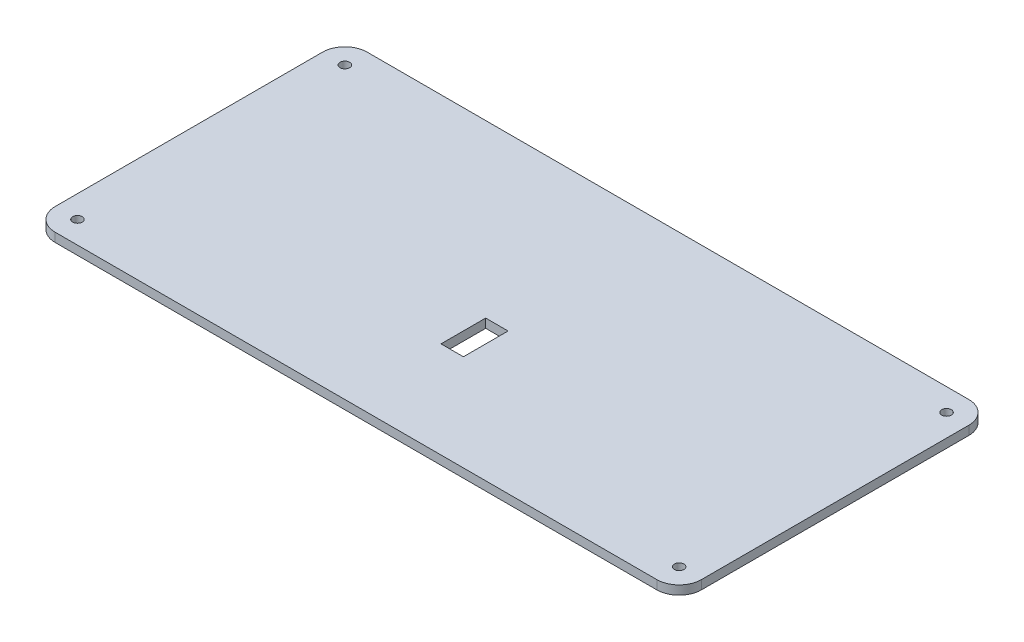
ISO-10303-21;
HEADER;
FILE_DESCRIPTION(('STEP AP214'),'2;1');
FILE_NAME('part.step','',(''),(''),'','','');
FILE_SCHEMA(('AUTOMOTIVE_DESIGN { 1 0 10303 214 1 1 1 1 }'));
ENDSEC;
DATA;
#1=APPLICATION_CONTEXT('core data for automotive mechanical design processes');
#2=APPLICATION_PROTOCOL_DEFINITION('international standard','automotive_design',2000,#1);
#3=PRODUCT_CONTEXT('',#1,'mechanical');
#4=PRODUCT('Part','Part','',(#3));
#5=PRODUCT_RELATED_PRODUCT_CATEGORY('part','',(#4));
#6=PRODUCT_DEFINITION_FORMATION('','',#4);
#7=PRODUCT_DEFINITION_CONTEXT('part definition',#1,'design');
#8=PRODUCT_DEFINITION('design','',#6,#7);
#9=PRODUCT_DEFINITION_SHAPE('','',#8);
#10=(LENGTH_UNIT() NAMED_UNIT(*) SI_UNIT(.MILLI.,.METRE.));
#11=(NAMED_UNIT(*) PLANE_ANGLE_UNIT() SI_UNIT($,.RADIAN.));
#12=(NAMED_UNIT(*) SI_UNIT($,.STERADIAN.) SOLID_ANGLE_UNIT());
#13=UNCERTAINTY_MEASURE_WITH_UNIT(LENGTH_MEASURE(1.E-05),#10,'distance_accuracy_value','');
#14=(GEOMETRIC_REPRESENTATION_CONTEXT(3) GLOBAL_UNCERTAINTY_ASSIGNED_CONTEXT((#13)) GLOBAL_UNIT_ASSIGNED_CONTEXT((#10,
#11,#12)) REPRESENTATION_CONTEXT('',''));
#15=CARTESIAN_POINT('',(0.,0.,0.));
#16=DIRECTION('',(0.,0.,1.));
#17=DIRECTION('',(1.,0.,0.));
#18=AXIS2_PLACEMENT_3D('',#15,#16,#17);
#19=CARTESIAN_POINT('',(0.,4.,70.));
#20=DIRECTION('',(0.,0.,1.));
#21=DIRECTION('',(1.,0.,0.));
#22=AXIS2_PLACEMENT_3D('',#19,#20,#21);
#23=PLANE('',#22);
#24=DIRECTION('',(-1.,0.,0.));
#25=VECTOR('',#24,1.);
#26=CARTESIAN_POINT('',(0.,0.,70.));
#27=LINE('',#26,#25);
#28=CARTESIAN_POINT('',(135.,0.,70.));
#29=VERTEX_POINT('',#28);
#30=CARTESIAN_POINT('',(-135.,0.,70.));
#31=VERTEX_POINT('',#30);
#32=EDGE_CURVE('E236',#29,#31,#27,.T.);
#33=ORIENTED_EDGE('',*,*,#32,.F.);
#34=DIRECTION('',(0.,-1.,0.));
#35=VECTOR('',#34,1.);
#36=CARTESIAN_POINT('',(135.,4.,70.));
#37=LINE('',#36,#35);
#38=CARTESIAN_POINT('',(135.,4.,70.));
#39=VERTEX_POINT('',#38);
#40=EDGE_CURVE('E11',#39,#29,#37,.T.);
#41=ORIENTED_EDGE('',*,*,#40,.F.);
#42=DIRECTION('',(-1.,0.,0.));
#43=VECTOR('',#42,1.);
#44=CARTESIAN_POINT('',(0.,4.,70.));
#45=LINE('',#44,#43);
#46=CARTESIAN_POINT('',(-135.,4.,70.));
#47=VERTEX_POINT('',#46);
#48=EDGE_CURVE('E226',#39,#47,#45,.T.);
#49=ORIENTED_EDGE('',*,*,#48,.T.);
#50=DIRECTION('',(0.,-1.,0.));
#51=VECTOR('',#50,1.);
#52=CARTESIAN_POINT('',(-135.,4.,70.));
#53=LINE('',#52,#51);
#54=EDGE_CURVE('E210',#47,#31,#53,.T.);
#55=ORIENTED_EDGE('',*,*,#54,.T.);
#56=EDGE_LOOP('',(#33,#41,#49,#55));
#57=FACE_BOUND('',#56,.T.);
#58=ADVANCED_FACE('F37',(#57),#23,.T.);
#59=CARTESIAN_POINT('',(135.,4.,60.));
#60=DIRECTION('',(0.,-1.,0.));
#61=DIRECTION('',(0.,0.,-1.));
#62=AXIS2_PLACEMENT_3D('',#59,#60,#61);
#63=CYLINDRICAL_SURFACE('',#62,10.);
#64=CARTESIAN_POINT('',(135.,0.,60.));
#65=DIRECTION('',(0.,1.,0.));
#66=DIRECTION('',(0.,0.,1.));
#67=AXIS2_PLACEMENT_3D('',#64,#65,#66);
#68=CIRCLE('',#67,10.);
#69=CARTESIAN_POINT('',(145.,0.,59.9999999999999));
#70=VERTEX_POINT('',#69);
#71=EDGE_CURVE('E238',#29,#70,#68,.T.);
#72=ORIENTED_EDGE('',*,*,#71,.T.);
#73=DIRECTION('',(0.,-1.,0.));
#74=VECTOR('',#73,1.);
#75=CARTESIAN_POINT('',(145.,4.,59.9999999999999));
#76=LINE('',#75,#74);
#77=CARTESIAN_POINT('',(145.,4.,59.9999999999999));
#78=VERTEX_POINT('',#77);
#79=EDGE_CURVE('E45',#78,#70,#76,.T.);
#80=ORIENTED_EDGE('',*,*,#79,.F.);
#81=CARTESIAN_POINT('',(135.,4.,60.));
#82=DIRECTION('',(0.,1.,0.));
#83=DIRECTION('',(0.,0.,1.));
#84=AXIS2_PLACEMENT_3D('',#81,#82,#83);
#85=CIRCLE('',#84,10.);
#86=EDGE_CURVE('E229',#39,#78,#85,.T.);
#87=ORIENTED_EDGE('',*,*,#86,.F.);
#88=ORIENTED_EDGE('',*,*,#40,.T.);
#89=EDGE_LOOP('',(#72,#80,#87,#88));
#90=FACE_BOUND('',#89,.T.);
#91=ADVANCED_FACE('F249',(#90),#63,.T.);
#92=CARTESIAN_POINT('',(145.,4.,0.));
#93=DIRECTION('',(1.,0.,0.));
#94=DIRECTION('',(0.,0.,-1.));
#95=AXIS2_PLACEMENT_3D('',#92,#93,#94);
#96=PLANE('',#95);
#97=DIRECTION('',(0.,0.,1.));
#98=VECTOR('',#97,1.);
#99=CARTESIAN_POINT('',(145.,0.,0.));
#100=LINE('',#99,#98);
#101=CARTESIAN_POINT('',(145.,0.,-59.9999999999999));
#102=VERTEX_POINT('',#101);
#103=EDGE_CURVE('E227',#102,#70,#100,.T.);
#104=ORIENTED_EDGE('',*,*,#103,.F.);
#105=DIRECTION('',(0.,-1.,0.));
#106=VECTOR('',#105,1.);
#107=CARTESIAN_POINT('',(145.,4.,-59.9999999999999));
#108=LINE('',#107,#106);
#109=CARTESIAN_POINT('',(145.,4.,-59.9999999999999));
#110=VERTEX_POINT('',#109);
#111=EDGE_CURVE('E176',#110,#102,#108,.T.);
#112=ORIENTED_EDGE('',*,*,#111,.F.);
#113=DIRECTION('',(0.,0.,1.));
#114=VECTOR('',#113,1.);
#115=CARTESIAN_POINT('',(145.,4.,0.));
#116=LINE('',#115,#114);
#117=EDGE_CURVE('E231',#110,#78,#116,.T.);
#118=ORIENTED_EDGE('',*,*,#117,.T.);
#119=ORIENTED_EDGE('',*,*,#79,.T.);
#120=EDGE_LOOP('',(#104,#112,#118,#119));
#121=FACE_BOUND('',#120,.T.);
#122=ADVANCED_FACE('F244',(#121),#96,.T.);
#123=CARTESIAN_POINT('',(135.,4.,60.));
#124=DIRECTION('',(0.,-1.,0.));
#125=DIRECTION('',(0.,0.,-1.));
#126=AXIS2_PLACEMENT_3D('',#123,#124,#125);
#127=CYLINDRICAL_SURFACE('',#126,2.15000000000002);
#128=CARTESIAN_POINT('',(135.,4.,60.));
#129=DIRECTION('',(0.,1.,0.));
#130=DIRECTION('',(0.,0.,1.));
#131=AXIS2_PLACEMENT_3D('',#128,#129,#130);
#132=CIRCLE('',#131,2.15000000000002);
#133=CARTESIAN_POINT('',(135.,4.,62.15));
#134=VERTEX_POINT('',#133);
#135=EDGE_CURVE('E223',#134,#134,#132,.T.);
#136=ORIENTED_EDGE('',*,*,#135,.T.);
#137=EDGE_LOOP('',(#136));
#138=FACE_BOUND('',#137,.T.);
#139=CARTESIAN_POINT('',(135.,0.,60.));
#140=DIRECTION('',(0.,1.,0.));
#141=DIRECTION('',(0.,0.,1.));
#142=AXIS2_PLACEMENT_3D('',#139,#140,#141);
#143=CIRCLE('',#142,2.15000000000002);
#144=CARTESIAN_POINT('',(135.,0.,62.15));
#145=VERTEX_POINT('',#144);
#146=EDGE_CURVE('E222',#145,#145,#143,.T.);
#147=ORIENTED_EDGE('',*,*,#146,.F.);
#148=EDGE_LOOP('',(#147));
#149=FACE_BOUND('',#148,.T.);
#150=ADVANCED_FACE('F39',(#138,#149),#127,.F.);
#151=CARTESIAN_POINT('',(0.,4.,0.));
#152=DIRECTION('',(0.,1.,0.));
#153=DIRECTION('',(0.,0.,1.));
#154=AXIS2_PLACEMENT_3D('',#151,#152,#153);
#155=PLANE('',#154);
#156=DIRECTION('',(0.,0.,1.));
#157=VECTOR('',#156,1.);
#158=CARTESIAN_POINT('',(-5.04999999999998,4.,26.8091388827732));
#159=LINE('',#158,#157);
#160=CARTESIAN_POINT('',(-5.04999999999998,4.,6.75913888277318));
#161=VERTEX_POINT('',#160);
#162=CARTESIAN_POINT('',(-5.04999999999998,4.,26.8091388827732));
#163=VERTEX_POINT('',#162);
#164=EDGE_CURVE('E52',#161,#163,#159,.T.);
#165=ORIENTED_EDGE('',*,*,#164,.F.);
#166=DIRECTION('',(-1.,0.,0.));
#167=VECTOR('',#166,1.);
#168=CARTESIAN_POINT('',(-5.04999999999998,4.,6.75913888277318));
#169=LINE('',#168,#167);
#170=CARTESIAN_POINT('',(5.00000000000002,4.,6.75913888277318));
#171=VERTEX_POINT('',#170);
#172=EDGE_CURVE('E143',#171,#161,#169,.T.);
#173=ORIENTED_EDGE('',*,*,#172,.F.);
#174=DIRECTION('',(0.,0.,-1.));
#175=VECTOR('',#174,1.);
#176=CARTESIAN_POINT('',(5.00000000000002,4.,26.8091388827732));
#177=LINE('',#176,#175);
#178=CARTESIAN_POINT('',(5.00000000000002,4.,26.8091388827732));
#179=VERTEX_POINT('',#178);
#180=EDGE_CURVE('E146',#179,#171,#177,.T.);
#181=ORIENTED_EDGE('',*,*,#180,.F.);
#182=DIRECTION('',(1.,0.,0.));
#183=VECTOR('',#182,1.);
#184=CARTESIAN_POINT('',(-5.04999999999998,4.,26.8091388827732));
#185=LINE('',#184,#183);
#186=EDGE_CURVE('E152',#163,#179,#185,.T.);
#187=ORIENTED_EDGE('',*,*,#186,.F.);
#188=EDGE_LOOP('',(#165,#173,#181,#187));
#189=FACE_BOUND('',#188,.T.);
#190=ORIENTED_EDGE('',*,*,#117,.F.);
#191=CARTESIAN_POINT('',(135.,4.,-60.));
#192=DIRECTION('',(0.,-1.,0.));
#193=DIRECTION('',(0.,0.,-1.));
#194=AXIS2_PLACEMENT_3D('',#191,#192,#193);
#195=CIRCLE('',#194,10.);
#196=CARTESIAN_POINT('',(135.,4.,-70.));
#197=VERTEX_POINT('',#196);
#198=EDGE_CURVE('E165',#197,#110,#195,.T.);
#199=ORIENTED_EDGE('',*,*,#198,.F.);
#200=DIRECTION('',(1.,0.,0.));
#201=VECTOR('',#200,1.);
#202=CARTESIAN_POINT('',(0.,4.,-70.));
#203=LINE('',#202,#201);
#204=CARTESIAN_POINT('',(-135.,4.,-70.));
#205=VERTEX_POINT('',#204);
#206=EDGE_CURVE('E183',#205,#197,#203,.T.);
#207=ORIENTED_EDGE('',*,*,#206,.F.);
#208=CARTESIAN_POINT('',(-135.,4.,-60.));
#209=DIRECTION('',(0.,1.,0.));
#210=DIRECTION('',(0.,0.,-1.));
#211=AXIS2_PLACEMENT_3D('',#208,#209,#210);
#212=CIRCLE('',#211,10.);
#213=CARTESIAN_POINT('',(-145.,4.,-59.9999999999999));
#214=VERTEX_POINT('',#213);
#215=EDGE_CURVE('E186',#205,#214,#212,.T.);
#216=ORIENTED_EDGE('',*,*,#215,.T.);
#217=DIRECTION('',(0.,0.,1.));
#218=VECTOR('',#217,1.);
#219=CARTESIAN_POINT('',(-145.,4.,0.));
#220=LINE('',#219,#218);
#221=CARTESIAN_POINT('',(-145.,4.,59.9999999999999));
#222=VERTEX_POINT('',#221);
#223=EDGE_CURVE('E204',#214,#222,#220,.T.);
#224=ORIENTED_EDGE('',*,*,#223,.T.);
#225=CARTESIAN_POINT('',(-135.,4.,60.));
#226=DIRECTION('',(0.,-1.,0.));
#227=DIRECTION('',(0.,0.,1.));
#228=AXIS2_PLACEMENT_3D('',#225,#226,#227);
#229=CIRCLE('',#228,10.);
#230=EDGE_CURVE('E207',#47,#222,#229,.T.);
#231=ORIENTED_EDGE('',*,*,#230,.F.);
#232=ORIENTED_EDGE('',*,*,#48,.F.);
#233=ORIENTED_EDGE('',*,*,#86,.T.);
#234=EDGE_LOOP('',(#190,#199,#207,#216,#224,#231,#232,#233));
#235=FACE_BOUND('',#234,.T.);
#236=ORIENTED_EDGE('',*,*,#135,.F.);
#237=EDGE_LOOP('',(#236));
#238=FACE_BOUND('',#237,.T.);
#239=CARTESIAN_POINT('',(-135.,4.,60.));
#240=DIRECTION('',(0.,-1.,0.));
#241=DIRECTION('',(0.,0.,1.));
#242=AXIS2_PLACEMENT_3D('',#239,#240,#241);
#243=CIRCLE('',#242,2.15000000000002);
#244=CARTESIAN_POINT('',(-135.,4.,62.15));
#245=VERTEX_POINT('',#244);
#246=EDGE_CURVE('E201',#245,#245,#243,.T.);
#247=ORIENTED_EDGE('',*,*,#246,.T.);
#248=EDGE_LOOP('',(#247));
#249=FACE_BOUND('',#248,.T.);
#250=CARTESIAN_POINT('',(-135.,4.,-60.));
#251=DIRECTION('',(0.,1.,0.));
#252=DIRECTION('',(0.,0.,-1.));
#253=AXIS2_PLACEMENT_3D('',#250,#251,#252);
#254=CIRCLE('',#253,2.15000000000002);
#255=CARTESIAN_POINT('',(-135.,4.,-62.15));
#256=VERTEX_POINT('',#255);
#257=EDGE_CURVE('E180',#256,#256,#254,.T.);
#258=ORIENTED_EDGE('',*,*,#257,.F.);
#259=EDGE_LOOP('',(#258));
#260=FACE_BOUND('',#259,.T.);
#261=CARTESIAN_POINT('',(135.,4.,-60.));
#262=DIRECTION('',(0.,-1.,0.));
#263=DIRECTION('',(0.,0.,-1.));
#264=AXIS2_PLACEMENT_3D('',#261,#262,#263);
#265=CIRCLE('',#264,2.15000000000002);
#266=CARTESIAN_POINT('',(135.,4.,-62.15));
#267=VERTEX_POINT('',#266);
#268=EDGE_CURVE('E162',#267,#267,#265,.T.);
#269=ORIENTED_EDGE('',*,*,#268,.T.);
#270=EDGE_LOOP('',(#269));
#271=FACE_BOUND('',#270,.T.);
#272=ADVANCED_FACE('F261',(#189,#235,#238,#249,#260,#271),#155,.T.);
#273=CARTESIAN_POINT('',(0.,0.,0.));
#274=DIRECTION('',(0.,1.,0.));
#275=DIRECTION('',(0.,0.,1.));
#276=AXIS2_PLACEMENT_3D('',#273,#274,#275);
#277=PLANE('',#276);
#278=DIRECTION('',(-1.,0.,0.));
#279=VECTOR('',#278,1.);
#280=CARTESIAN_POINT('',(-5.04999999999998,0.,6.75913888277318));
#281=LINE('',#280,#279);
#282=CARTESIAN_POINT('',(5.00000000000002,0.,6.75913888277318));
#283=VERTEX_POINT('',#282);
#284=CARTESIAN_POINT('',(-5.04999999999998,0.,6.75913888277318));
#285=VERTEX_POINT('',#284);
#286=EDGE_CURVE('E133',#283,#285,#281,.T.);
#287=ORIENTED_EDGE('',*,*,#286,.T.);
#288=DIRECTION('',(0.,0.,1.));
#289=VECTOR('',#288,1.);
#290=CARTESIAN_POINT('',(-5.04999999999998,0.,26.8091388827732));
#291=LINE('',#290,#289);
#292=CARTESIAN_POINT('',(-5.04999999999998,0.,26.8091388827732));
#293=VERTEX_POINT('',#292);
#294=EDGE_CURVE('E127',#285,#293,#291,.T.);
#295=ORIENTED_EDGE('',*,*,#294,.T.);
#296=DIRECTION('',(1.,0.,0.));
#297=VECTOR('',#296,1.);
#298=CARTESIAN_POINT('',(-5.04999999999998,0.,26.8091388827732));
#299=LINE('',#298,#297);
#300=CARTESIAN_POINT('',(5.00000000000002,0.,26.8091388827732));
#301=VERTEX_POINT('',#300);
#302=EDGE_CURVE('E136',#293,#301,#299,.T.);
#303=ORIENTED_EDGE('',*,*,#302,.T.);
#304=DIRECTION('',(0.,0.,-1.));
#305=VECTOR('',#304,1.);
#306=CARTESIAN_POINT('',(5.00000000000002,0.,26.8091388827732));
#307=LINE('',#306,#305);
#308=EDGE_CURVE('E60',#301,#283,#307,.T.);
#309=ORIENTED_EDGE('',*,*,#308,.T.);
#310=EDGE_LOOP('',(#287,#295,#303,#309));
#311=FACE_BOUND('',#310,.T.);
#312=CARTESIAN_POINT('',(135.,0.,-60.));
#313=DIRECTION('',(0.,-1.,0.));
#314=DIRECTION('',(0.,0.,-1.));
#315=AXIS2_PLACEMENT_3D('',#312,#313,#314);
#316=CIRCLE('',#315,10.);
#317=CARTESIAN_POINT('',(135.,0.,-70.));
#318=VERTEX_POINT('',#317);
#319=EDGE_CURVE('E166',#318,#102,#316,.T.);
#320=ORIENTED_EDGE('',*,*,#319,.T.);
#321=ORIENTED_EDGE('',*,*,#103,.T.);
#322=ORIENTED_EDGE('',*,*,#71,.F.);
#323=ORIENTED_EDGE('',*,*,#32,.T.);
#324=CARTESIAN_POINT('',(-135.,0.,60.));
#325=DIRECTION('',(0.,-1.,0.));
#326=DIRECTION('',(0.,0.,1.));
#327=AXIS2_PLACEMENT_3D('',#324,#325,#326);
#328=CIRCLE('',#327,10.);
#329=CARTESIAN_POINT('',(-145.,0.,59.9999999999999));
#330=VERTEX_POINT('',#329);
#331=EDGE_CURVE('E205',#31,#330,#328,.T.);
#332=ORIENTED_EDGE('',*,*,#331,.T.);
#333=DIRECTION('',(0.,0.,1.));
#334=VECTOR('',#333,1.);
#335=CARTESIAN_POINT('',(-145.,0.,0.));
#336=LINE('',#335,#334);
#337=CARTESIAN_POINT('',(-145.,0.,-59.9999999999999));
#338=VERTEX_POINT('',#337);
#339=EDGE_CURVE('E213',#338,#330,#336,.T.);
#340=ORIENTED_EDGE('',*,*,#339,.F.);
#341=CARTESIAN_POINT('',(-135.,0.,-60.));
#342=DIRECTION('',(0.,1.,0.));
#343=DIRECTION('',(0.,0.,-1.));
#344=AXIS2_PLACEMENT_3D('',#341,#342,#343);
#345=CIRCLE('',#344,10.);
#346=CARTESIAN_POINT('',(-135.,0.,-70.));
#347=VERTEX_POINT('',#346);
#348=EDGE_CURVE('E184',#347,#338,#345,.T.);
#349=ORIENTED_EDGE('',*,*,#348,.F.);
#350=DIRECTION('',(1.,0.,0.));
#351=VECTOR('',#350,1.);
#352=CARTESIAN_POINT('',(0.,0.,-70.));
#353=LINE('',#352,#351);
#354=EDGE_CURVE('E192',#347,#318,#353,.T.);
#355=ORIENTED_EDGE('',*,*,#354,.T.);
#356=EDGE_LOOP('',(#320,#321,#322,#323,#332,#340,#349,#355));
#357=FACE_BOUND('',#356,.T.);
#358=ORIENTED_EDGE('',*,*,#146,.T.);
#359=EDGE_LOOP('',(#358));
#360=FACE_BOUND('',#359,.T.);
#361=CARTESIAN_POINT('',(-135.,0.,60.));
#362=DIRECTION('',(0.,-1.,0.));
#363=DIRECTION('',(0.,0.,1.));
#364=AXIS2_PLACEMENT_3D('',#361,#362,#363);
#365=CIRCLE('',#364,2.15000000000002);
#366=CARTESIAN_POINT('',(-135.,0.,62.15));
#367=VERTEX_POINT('',#366);
#368=EDGE_CURVE('E200',#367,#367,#365,.T.);
#369=ORIENTED_EDGE('',*,*,#368,.F.);
#370=EDGE_LOOP('',(#369));
#371=FACE_BOUND('',#370,.T.);
#372=CARTESIAN_POINT('',(-135.,0.,-60.));
#373=DIRECTION('',(0.,1.,0.));
#374=DIRECTION('',(0.,0.,-1.));
#375=AXIS2_PLACEMENT_3D('',#372,#373,#374);
#376=CIRCLE('',#375,2.15000000000002);
#377=CARTESIAN_POINT('',(-135.,0.,-62.15));
#378=VERTEX_POINT('',#377);
#379=EDGE_CURVE('E179',#378,#378,#376,.T.);
#380=ORIENTED_EDGE('',*,*,#379,.T.);
#381=EDGE_LOOP('',(#380));
#382=FACE_BOUND('',#381,.T.);
#383=CARTESIAN_POINT('',(135.,0.,-60.));
#384=DIRECTION('',(0.,-1.,0.));
#385=DIRECTION('',(0.,0.,-1.));
#386=AXIS2_PLACEMENT_3D('',#383,#384,#385);
#387=CIRCLE('',#386,2.15000000000002);
#388=CARTESIAN_POINT('',(135.,0.,-62.15));
#389=VERTEX_POINT('',#388);
#390=EDGE_CURVE('E158',#389,#389,#387,.T.);
#391=ORIENTED_EDGE('',*,*,#390,.F.);
#392=EDGE_LOOP('',(#391));
#393=FACE_BOUND('',#392,.T.);
#394=ADVANCED_FACE('F140',(#311,#357,#360,#371,#382,#393),#277,.F.);
#395=CARTESIAN_POINT('',(-145.,4.,0.));
#396=DIRECTION('',(1.,0.,0.));
#397=DIRECTION('',(0.,0.,-1.));
#398=AXIS2_PLACEMENT_3D('',#395,#396,#397);
#399=PLANE('',#398);
#400=ORIENTED_EDGE('',*,*,#339,.T.);
#401=DIRECTION('',(0.,-1.,0.));
#402=VECTOR('',#401,1.);
#403=CARTESIAN_POINT('',(-145.,4.,59.9999999999999));
#404=LINE('',#403,#402);
#405=EDGE_CURVE('E220',#222,#330,#404,.T.);
#406=ORIENTED_EDGE('',*,*,#405,.F.);
#407=ORIENTED_EDGE('',*,*,#223,.F.);
#408=DIRECTION('',(0.,-1.,0.));
#409=VECTOR('',#408,1.);
#410=CARTESIAN_POINT('',(-145.,4.,-59.9999999999999));
#411=LINE('',#410,#409);
#412=EDGE_CURVE('E189',#214,#338,#411,.T.);
#413=ORIENTED_EDGE('',*,*,#412,.T.);
#414=EDGE_LOOP('',(#400,#406,#407,#413));
#415=FACE_BOUND('',#414,.T.);
#416=ADVANCED_FACE('F273',(#415),#399,.F.);
#417=CARTESIAN_POINT('',(-135.,4.,60.));
#418=DIRECTION('',(0.,-1.,0.));
#419=DIRECTION('',(0.,0.,-1.));
#420=AXIS2_PLACEMENT_3D('',#417,#418,#419);
#421=CYLINDRICAL_SURFACE('',#420,2.15000000000002);
#422=ORIENTED_EDGE('',*,*,#246,.F.);
#423=EDGE_LOOP('',(#422));
#424=FACE_BOUND('',#423,.T.);
#425=ORIENTED_EDGE('',*,*,#368,.T.);
#426=EDGE_LOOP('',(#425));
#427=FACE_BOUND('',#426,.T.);
#428=ADVANCED_FACE('F287',(#424,#427),#421,.F.);
#429=CARTESIAN_POINT('',(-135.,4.,60.));
#430=DIRECTION('',(0.,-1.,0.));
#431=DIRECTION('',(0.,0.,-1.));
#432=AXIS2_PLACEMENT_3D('',#429,#430,#431);
#433=CYLINDRICAL_SURFACE('',#432,10.);
#434=ORIENTED_EDGE('',*,*,#331,.F.);
#435=ORIENTED_EDGE('',*,*,#54,.F.);
#436=ORIENTED_EDGE('',*,*,#230,.T.);
#437=ORIENTED_EDGE('',*,*,#405,.T.);
#438=EDGE_LOOP('',(#434,#435,#436,#437));
#439=FACE_BOUND('',#438,.T.);
#440=ADVANCED_FACE('F269',(#439),#433,.T.);
#441=CARTESIAN_POINT('',(0.,4.,-70.));
#442=DIRECTION('',(0.,0.,-1.));
#443=DIRECTION('',(-1.,0.,0.));
#444=AXIS2_PLACEMENT_3D('',#441,#442,#443);
#445=PLANE('',#444);
#446=ORIENTED_EDGE('',*,*,#354,.F.);
#447=DIRECTION('',(0.,-1.,0.));
#448=VECTOR('',#447,1.);
#449=CARTESIAN_POINT('',(-135.,4.,-70.));
#450=LINE('',#449,#448);
#451=EDGE_CURVE('E198',#205,#347,#450,.T.);
#452=ORIENTED_EDGE('',*,*,#451,.F.);
#453=ORIENTED_EDGE('',*,*,#206,.T.);
#454=DIRECTION('',(0.,-1.,0.));
#455=VECTOR('',#454,1.);
#456=CARTESIAN_POINT('',(135.,4.,-70.));
#457=LINE('',#456,#455);
#458=EDGE_CURVE('E169',#197,#318,#457,.T.);
#459=ORIENTED_EDGE('',*,*,#458,.T.);
#460=EDGE_LOOP('',(#446,#452,#453,#459));
#461=FACE_BOUND('',#460,.T.);
#462=ADVANCED_FACE('F278',(#461),#445,.T.);
#463=CARTESIAN_POINT('',(-135.,4.,-60.));
#464=DIRECTION('',(0.,-1.,0.));
#465=DIRECTION('',(0.,0.,-1.));
#466=AXIS2_PLACEMENT_3D('',#463,#464,#465);
#467=CYLINDRICAL_SURFACE('',#466,10.);
#468=ORIENTED_EDGE('',*,*,#348,.T.);
#469=ORIENTED_EDGE('',*,*,#412,.F.);
#470=ORIENTED_EDGE('',*,*,#215,.F.);
#471=ORIENTED_EDGE('',*,*,#451,.T.);
#472=EDGE_LOOP('',(#468,#469,#470,#471));
#473=FACE_BOUND('',#472,.T.);
#474=ADVANCED_FACE('F276',(#473),#467,.T.);
#475=CARTESIAN_POINT('',(-135.,4.,-60.));
#476=DIRECTION('',(0.,-1.,0.));
#477=DIRECTION('',(0.,0.,-1.));
#478=AXIS2_PLACEMENT_3D('',#475,#476,#477);
#479=CYLINDRICAL_SURFACE('',#478,2.15000000000002);
#480=ORIENTED_EDGE('',*,*,#257,.T.);
#481=EDGE_LOOP('',(#480));
#482=FACE_BOUND('',#481,.T.);
#483=ORIENTED_EDGE('',*,*,#379,.F.);
#484=EDGE_LOOP('',(#483));
#485=FACE_BOUND('',#484,.T.);
#486=ADVANCED_FACE('F285',(#482,#485),#479,.F.);
#487=CARTESIAN_POINT('',(135.,4.,-60.));
#488=DIRECTION('',(0.,-1.,0.));
#489=DIRECTION('',(0.,0.,-1.));
#490=AXIS2_PLACEMENT_3D('',#487,#488,#489);
#491=CYLINDRICAL_SURFACE('',#490,2.15000000000002);
#492=ORIENTED_EDGE('',*,*,#268,.F.);
#493=EDGE_LOOP('',(#492));
#494=FACE_BOUND('',#493,.T.);
#495=ORIENTED_EDGE('',*,*,#390,.T.);
#496=EDGE_LOOP('',(#495));
#497=FACE_BOUND('',#496,.T.);
#498=ADVANCED_FACE('F308',(#494,#497),#491,.F.);
#499=CARTESIAN_POINT('',(135.,4.,-60.));
#500=DIRECTION('',(0.,-1.,0.));
#501=DIRECTION('',(0.,0.,-1.));
#502=AXIS2_PLACEMENT_3D('',#499,#500,#501);
#503=CYLINDRICAL_SURFACE('',#502,10.);
#504=ORIENTED_EDGE('',*,*,#319,.F.);
#505=ORIENTED_EDGE('',*,*,#458,.F.);
#506=ORIENTED_EDGE('',*,*,#198,.T.);
#507=ORIENTED_EDGE('',*,*,#111,.T.);
#508=EDGE_LOOP('',(#504,#505,#506,#507));
#509=FACE_BOUND('',#508,.T.);
#510=ADVANCED_FACE('F257',(#509),#503,.T.);
#511=CARTESIAN_POINT('',(-5.04999999999998,0.,26.8091388827732));
#512=DIRECTION('',(-1.,0.,0.));
#513=DIRECTION('',(0.,0.,1.));
#514=AXIS2_PLACEMENT_3D('',#511,#512,#513);
#515=PLANE('',#514);
#516=ORIENTED_EDGE('',*,*,#164,.T.);
#517=DIRECTION('',(0.,1.,0.));
#518=VECTOR('',#517,1.);
#519=CARTESIAN_POINT('',(-5.04999999999998,0.,26.8091388827732));
#520=LINE('',#519,#518);
#521=EDGE_CURVE('E123',#293,#163,#520,.T.);
#522=ORIENTED_EDGE('',*,*,#521,.F.);
#523=ORIENTED_EDGE('',*,*,#294,.F.);
#524=DIRECTION('',(0.,1.,0.));
#525=VECTOR('',#524,1.);
#526=CARTESIAN_POINT('',(-5.04999999999998,0.,6.75913888277318));
#527=LINE('',#526,#525);
#528=EDGE_CURVE('E156',#285,#161,#527,.T.);
#529=ORIENTED_EDGE('',*,*,#528,.T.);
#530=EDGE_LOOP('',(#516,#522,#523,#529));
#531=FACE_BOUND('',#530,.T.);
#532=ADVANCED_FACE('F125',(#531),#515,.F.);
#533=CARTESIAN_POINT('',(-5.04999999999998,0.,6.75913888277318));
#534=DIRECTION('',(0.,0.,-1.));
#535=DIRECTION('',(-1.,0.,0.));
#536=AXIS2_PLACEMENT_3D('',#533,#534,#535);
#537=PLANE('',#536);
#538=ORIENTED_EDGE('',*,*,#172,.T.);
#539=ORIENTED_EDGE('',*,*,#528,.F.);
#540=ORIENTED_EDGE('',*,*,#286,.F.);
#541=DIRECTION('',(0.,1.,0.));
#542=VECTOR('',#541,1.);
#543=CARTESIAN_POINT('',(5.00000000000002,0.,6.75913888277318));
#544=LINE('',#543,#542);
#545=EDGE_CURVE('E159',#283,#171,#544,.T.);
#546=ORIENTED_EDGE('',*,*,#545,.T.);
#547=EDGE_LOOP('',(#538,#539,#540,#546));
#548=FACE_BOUND('',#547,.T.);
#549=ADVANCED_FACE('F332',(#548),#537,.F.);
#550=CARTESIAN_POINT('',(5.00000000000002,0.,26.8091388827732));
#551=DIRECTION('',(1.,0.,0.));
#552=DIRECTION('',(0.,0.,-1.));
#553=AXIS2_PLACEMENT_3D('',#550,#551,#552);
#554=PLANE('',#553);
#555=ORIENTED_EDGE('',*,*,#180,.T.);
#556=ORIENTED_EDGE('',*,*,#545,.F.);
#557=ORIENTED_EDGE('',*,*,#308,.F.);
#558=DIRECTION('',(0.,1.,0.));
#559=VECTOR('',#558,1.);
#560=CARTESIAN_POINT('',(5.00000000000002,0.,26.8091388827732));
#561=LINE('',#560,#559);
#562=EDGE_CURVE('E132',#301,#179,#561,.T.);
#563=ORIENTED_EDGE('',*,*,#562,.T.);
#564=EDGE_LOOP('',(#555,#556,#557,#563));
#565=FACE_BOUND('',#564,.T.);
#566=ADVANCED_FACE('F335',(#565),#554,.F.);
#567=CARTESIAN_POINT('',(-5.04999999999998,0.,26.8091388827732));
#568=DIRECTION('',(0.,0.,1.));
#569=DIRECTION('',(1.,0.,0.));
#570=AXIS2_PLACEMENT_3D('',#567,#568,#569);
#571=PLANE('',#570);
#572=ORIENTED_EDGE('',*,*,#186,.T.);
#573=ORIENTED_EDGE('',*,*,#562,.F.);
#574=ORIENTED_EDGE('',*,*,#302,.F.);
#575=ORIENTED_EDGE('',*,*,#521,.T.);
#576=EDGE_LOOP('',(#572,#573,#574,#575));
#577=FACE_BOUND('',#576,.T.);
#578=ADVANCED_FACE('F137',(#577),#571,.F.);
#579=CLOSED_SHELL('',(#58,#91,#122,#150,#272,#394,#416,#428,#440,#462,#474,#486,#498,#510,#532,
#549,#566,#578));
#580=MANIFOLD_SOLID_BREP('B2',#579);
#581=ADVANCED_BREP_SHAPE_REPRESENTATION('',(#18,#580),#14);
#582=SHAPE_DEFINITION_REPRESENTATION(#9,#581);
ENDSEC;
END-ISO-10303-21;
